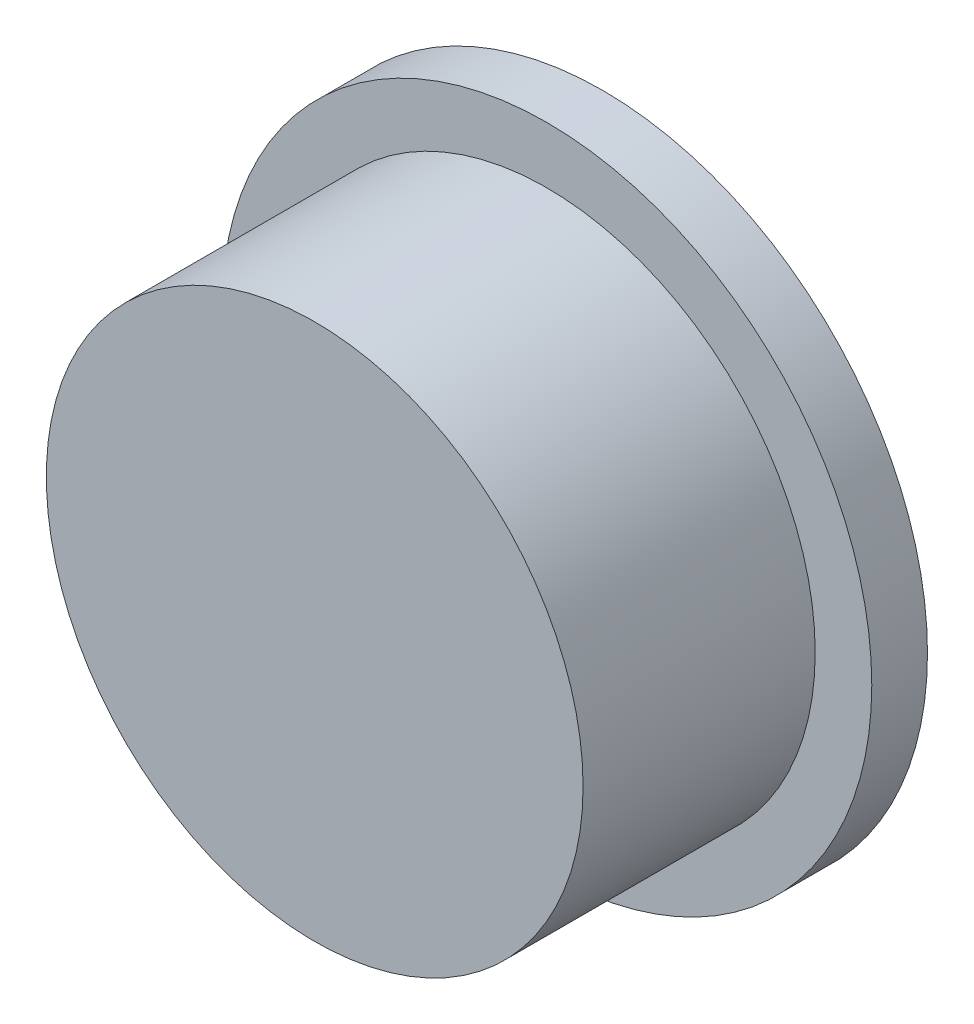
ISO-10303-21;
HEADER;
FILE_DESCRIPTION(('STEP AP214'),'2;1');
FILE_NAME('part.step','',(''),(''),'','','');
FILE_SCHEMA(('AUTOMOTIVE_DESIGN { 1 0 10303 214 1 1 1 1 }'));
ENDSEC;
DATA;
#1=APPLICATION_CONTEXT('core data for automotive mechanical design processes');
#2=APPLICATION_PROTOCOL_DEFINITION('international standard','automotive_design',2000,#1);
#3=PRODUCT_CONTEXT('',#1,'mechanical');
#4=PRODUCT('Part','Part','',(#3));
#5=PRODUCT_RELATED_PRODUCT_CATEGORY('part','',(#4));
#6=PRODUCT_DEFINITION_FORMATION('','',#4);
#7=PRODUCT_DEFINITION_CONTEXT('part definition',#1,'design');
#8=PRODUCT_DEFINITION('design','',#6,#7);
#9=PRODUCT_DEFINITION_SHAPE('','',#8);
#10=(LENGTH_UNIT() NAMED_UNIT(*) SI_UNIT(.MILLI.,.METRE.));
#11=(NAMED_UNIT(*) PLANE_ANGLE_UNIT() SI_UNIT($,.RADIAN.));
#12=(NAMED_UNIT(*) SI_UNIT($,.STERADIAN.) SOLID_ANGLE_UNIT());
#13=UNCERTAINTY_MEASURE_WITH_UNIT(LENGTH_MEASURE(1.E-05),#10,'distance_accuracy_value','');
#14=(GEOMETRIC_REPRESENTATION_CONTEXT(3) GLOBAL_UNCERTAINTY_ASSIGNED_CONTEXT((#13)) GLOBAL_UNIT_ASSIGNED_CONTEXT((#10,
#11,#12)) REPRESENTATION_CONTEXT('',''));
#15=CARTESIAN_POINT('',(0.,0.,0.));
#16=DIRECTION('',(0.,0.,1.));
#17=DIRECTION('',(1.,0.,0.));
#18=AXIS2_PLACEMENT_3D('',#15,#16,#17);
#19=CARTESIAN_POINT('',(0.,0.,7.874));
#20=DIRECTION('',(0.,0.,1.));
#21=DIRECTION('',(1.,0.,0.));
#22=AXIS2_PLACEMENT_3D('',#19,#20,#21);
#23=PLANE('',#22);
#24=CARTESIAN_POINT('',(0.,0.,7.874));
#25=DIRECTION('',(0.,0.,1.));
#26=DIRECTION('',(1.,0.,0.));
#27=AXIS2_PLACEMENT_3D('',#24,#25,#26);
#28=CIRCLE('',#27,7.3421875);
#29=CARTESIAN_POINT('',(7.3421875,0.,7.874));
#30=VERTEX_POINT('',#29);
#31=EDGE_CURVE('E18',#30,#30,#28,.F.);
#32=ORIENTED_EDGE('',*,*,#31,.F.);
#33=EDGE_LOOP('',(#32));
#34=FACE_BOUND('',#33,.T.);
#35=ADVANCED_FACE('F15',(#34),#23,.T.);
#36=CARTESIAN_POINT('',(0.,0.,1.524));
#37=DIRECTION('',(0.,0.,1.));
#38=DIRECTION('',(1.,0.,0.));
#39=AXIS2_PLACEMENT_3D('',#36,#37,#38);
#40=CYLINDRICAL_SURFACE('',#39,7.3421875);
#41=ORIENTED_EDGE('',*,*,#31,.T.);
#42=EDGE_LOOP('',(#41));
#43=FACE_BOUND('',#42,.T.);
#44=CARTESIAN_POINT('',(0.,0.,1.524));
#45=DIRECTION('',(0.,0.,1.));
#46=DIRECTION('',(1.,0.,0.));
#47=AXIS2_PLACEMENT_3D('',#44,#45,#46);
#48=CIRCLE('',#47,7.3421875);
#49=CARTESIAN_POINT('',(7.3421875,0.,1.524));
#50=VERTEX_POINT('',#49);
#51=EDGE_CURVE('E27',#50,#50,#48,.F.);
#52=ORIENTED_EDGE('',*,*,#51,.F.);
#53=EDGE_LOOP('',(#52));
#54=FACE_BOUND('',#53,.T.);
#55=ADVANCED_FACE('F35',(#43,#54),#40,.T.);
#56=CARTESIAN_POINT('',(0.,0.,1.524));
#57=DIRECTION('',(0.,0.,1.));
#58=DIRECTION('',(1.,0.,0.));
#59=AXIS2_PLACEMENT_3D('',#56,#57,#58);
#60=PLANE('',#59);
#61=ORIENTED_EDGE('',*,*,#51,.T.);
#62=EDGE_LOOP('',(#61));
#63=FACE_BOUND('',#62,.T.);
#64=CARTESIAN_POINT('',(0.,0.,1.524));
#65=DIRECTION('',(0.,0.,1.));
#66=DIRECTION('',(1.,0.,0.));
#67=AXIS2_PLACEMENT_3D('',#64,#65,#66);
#68=CIRCLE('',#67,8.89);
#69=CARTESIAN_POINT('',(8.89,0.,1.524));
#70=VERTEX_POINT('',#69);
#71=EDGE_CURVE('E22',#70,#70,#68,.F.);
#72=ORIENTED_EDGE('',*,*,#71,.F.);
#73=EDGE_LOOP('',(#72));
#74=FACE_BOUND('',#73,.T.);
#75=ADVANCED_FACE('F43',(#63,#74),#60,.T.);
#76=CARTESIAN_POINT('',(0.,0.,0.));
#77=DIRECTION('',(0.,0.,1.));
#78=DIRECTION('',(1.,0.,0.));
#79=AXIS2_PLACEMENT_3D('',#76,#77,#78);
#80=CYLINDRICAL_SURFACE('',#79,8.89);
#81=ORIENTED_EDGE('',*,*,#71,.T.);
#82=EDGE_LOOP('',(#81));
#83=FACE_BOUND('',#82,.T.);
#84=CARTESIAN_POINT('',(0.,0.,0.));
#85=DIRECTION('',(0.,0.,1.));
#86=DIRECTION('',(1.,0.,0.));
#87=AXIS2_PLACEMENT_3D('',#84,#85,#86);
#88=CIRCLE('',#87,8.89);
#89=CARTESIAN_POINT('',(8.89,0.,0.));
#90=VERTEX_POINT('',#89);
#91=EDGE_CURVE('E10',#90,#90,#88,.T.);
#92=ORIENTED_EDGE('',*,*,#91,.T.);
#93=EDGE_LOOP('',(#92));
#94=FACE_BOUND('',#93,.T.);
#95=ADVANCED_FACE('F46',(#83,#94),#80,.T.);
#96=CARTESIAN_POINT('',(0.,0.,0.));
#97=DIRECTION('',(0.,0.,1.));
#98=DIRECTION('',(1.,0.,0.));
#99=AXIS2_PLACEMENT_3D('',#96,#97,#98);
#100=PLANE('',#99);
#101=ORIENTED_EDGE('',*,*,#91,.F.);
#102=EDGE_LOOP('',(#101));
#103=FACE_BOUND('',#102,.T.);
#104=ADVANCED_FACE('F44',(#103),#100,.F.);
#105=CLOSED_SHELL('',(#35,#55,#75,#95,#104));
#106=MANIFOLD_SOLID_BREP('B1',#105);
#107=ADVANCED_BREP_SHAPE_REPRESENTATION('',(#18,#106),#14);
#108=SHAPE_DEFINITION_REPRESENTATION(#9,#107);
ENDSEC;
END-ISO-10303-21;
